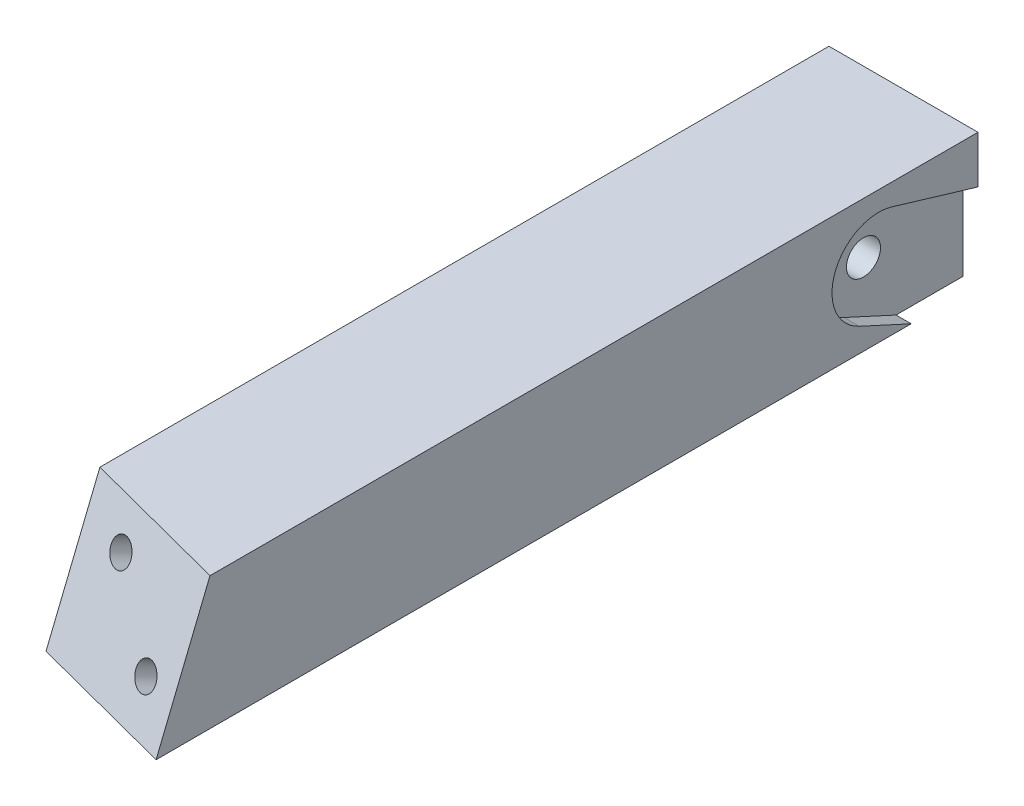
ISO-10303-21;
HEADER;
FILE_DESCRIPTION(('STEP AP214'),'2;1');
FILE_NAME('part.step','',(''),(''),'','','');
FILE_SCHEMA(('AUTOMOTIVE_DESIGN { 1 0 10303 214 1 1 1 1 }'));
ENDSEC;
DATA;
#1=APPLICATION_CONTEXT('core data for automotive mechanical design processes');
#2=APPLICATION_PROTOCOL_DEFINITION('international standard','automotive_design',2000,#1);
#3=PRODUCT_CONTEXT('',#1,'mechanical');
#4=PRODUCT('Part','Part','',(#3));
#5=PRODUCT_RELATED_PRODUCT_CATEGORY('part','',(#4));
#6=PRODUCT_DEFINITION_FORMATION('','',#4);
#7=PRODUCT_DEFINITION_CONTEXT('part definition',#1,'design');
#8=PRODUCT_DEFINITION('design','',#6,#7);
#9=PRODUCT_DEFINITION_SHAPE('','',#8);
#10=(LENGTH_UNIT() NAMED_UNIT(*) SI_UNIT(.MILLI.,.METRE.));
#11=(NAMED_UNIT(*) PLANE_ANGLE_UNIT() SI_UNIT($,.RADIAN.));
#12=(NAMED_UNIT(*) SI_UNIT($,.STERADIAN.) SOLID_ANGLE_UNIT());
#13=UNCERTAINTY_MEASURE_WITH_UNIT(LENGTH_MEASURE(1.E-05),#10,'distance_accuracy_value','');
#14=(GEOMETRIC_REPRESENTATION_CONTEXT(3) GLOBAL_UNCERTAINTY_ASSIGNED_CONTEXT((#13)) GLOBAL_UNIT_ASSIGNED_CONTEXT((#10,
#11,#12)) REPRESENTATION_CONTEXT('',''));
#15=CARTESIAN_POINT('',(0.,0.,0.));
#16=DIRECTION('',(0.,0.,1.));
#17=DIRECTION('',(1.,0.,0.));
#18=AXIS2_PLACEMENT_3D('',#15,#16,#17);
#19=CARTESIAN_POINT('',(14.2875,-12.7,-19.05));
#20=DIRECTION('',(-1.,0.,0.));
#21=DIRECTION('',(0.,0.,-1.));
#22=AXIS2_PLACEMENT_3D('',#19,#20,#21);
#23=PLANE('',#22);
#24=DIRECTION('',(0.,1.,0.));
#25=VECTOR('',#24,1.);
#26=CARTESIAN_POINT('',(14.2875,-12.7,-19.05));
#27=LINE('',#26,#25);
#28=CARTESIAN_POINT('',(14.2875,3.61894096300667,-19.05));
#29=VERTEX_POINT('',#28);
#30=CARTESIAN_POINT('',(14.2875,12.7,-19.05));
#31=VERTEX_POINT('',#30);
#32=EDGE_CURVE('E249',#29,#31,#27,.T.);
#33=ORIENTED_EDGE('',*,*,#32,.T.);
#34=DIRECTION('',(0.,0.,1.));
#35=VECTOR('',#34,1.);
#36=CARTESIAN_POINT('',(14.2875,12.7,-19.05));
#37=LINE('',#36,#35);
#38=CARTESIAN_POINT('',(14.2875,12.7,128.209561077673));
#39=VERTEX_POINT('',#38);
#40=EDGE_CURVE('E174',#31,#39,#37,.T.);
#41=ORIENTED_EDGE('',*,*,#40,.T.);
#42=DIRECTION('',(0.,0.926236048785543,-0.376944003706314));
#43=VECTOR('',#42,1.);
#44=CARTESIAN_POINT('',(14.2875,-23.679683207084,143.014754051566));
#45=LINE('',#44,#43);
#46=CARTESIAN_POINT('',(14.2875,-12.7,138.546426833108));
#47=VERTEX_POINT('',#46);
#48=EDGE_CURVE('E246',#47,#39,#45,.T.);
#49=ORIENTED_EDGE('',*,*,#48,.F.);
#50=DIRECTION('',(0.,0.,1.));
#51=VECTOR('',#50,1.);
#52=CARTESIAN_POINT('',(14.2875,-12.7,-19.05));
#53=LINE('',#52,#51);
#54=CARTESIAN_POINT('',(14.2875,-12.7,-6.24386157288385));
#55=VERTEX_POINT('',#54);
#56=EDGE_CURVE('E158',#55,#47,#53,.T.);
#57=ORIENTED_EDGE('',*,*,#56,.F.);
#58=DIRECTION('',(0.,0.416885836368103,0.908958854643964));
#59=VECTOR('',#58,1.);
#60=CARTESIAN_POINT('',(14.2875,-17.5526565728913,-16.8243725321985));
#61=LINE('',#60,#59);
#62=CARTESIAN_POINT('',(14.2875,-8.12681932760075,3.72729288579994));
#63=VERTEX_POINT('',#62);
#64=EDGE_CURVE('E239',#55,#63,#61,.T.);
#65=ORIENTED_EDGE('',*,*,#64,.T.);
#66=CARTESIAN_POINT('',(14.2875,0.,0.));
#67=DIRECTION('',(1.,0.,0.));
#68=DIRECTION('',(0.,0.,-1.));
#69=AXIS2_PLACEMENT_3D('',#66,#67,#68);
#70=CIRCLE('',#69,8.9408);
#71=CARTESIAN_POINT('',(14.2875,8.56365769597212,-2.56937181159471));
#72=VERTEX_POINT('',#71);
#73=EDGE_CURVE('E183',#63,#72,#70,.F.);
#74=ORIENTED_EDGE('',*,*,#73,.T.);
#75=DIRECTION('',(0.,0.287376052656888,0.957817834642551));
#76=VECTOR('',#75,1.);
#77=CARTESIAN_POINT('',(14.2875,2.27124129471666,-23.5418522823863));
#78=LINE('',#77,#76);
#79=EDGE_CURVE('E236',#29,#72,#78,.T.);
#80=ORIENTED_EDGE('',*,*,#79,.F.);
#81=EDGE_LOOP('',(#33,#41,#49,#57,#65,#74,#80));
#82=FACE_BOUND('',#81,.T.);
#83=ADVANCED_FACE('F41',(#82),#23,.F.);
#84=CARTESIAN_POINT('',(-14.2875,-12.7,-19.05));
#85=DIRECTION('',(0.,1.,0.));
#86=DIRECTION('',(0.,0.,-1.));
#87=AXIS2_PLACEMENT_3D('',#84,#85,#86);
#88=PLANE('',#87);
#89=DIRECTION('',(-0.967499485345023,0.,-0.252872983644192));
#90=VECTOR('',#89,1.);
#91=CARTESIAN_POINT('',(-45.8397648380304,-12.7,101.669894835493));
#92=LINE('',#91,#90);
#93=CARTESIAN_POINT('',(13.9790305203467,-12.7,117.304587659004));
#94=VERTEX_POINT('',#93);
#95=CARTESIAN_POINT('',(9.43867397200995,-12.7,116.117885728329));
#96=VERTEX_POINT('',#95);
#97=EDGE_CURVE('E11',#94,#96,#92,.T.);
#98=ORIENTED_EDGE('',*,*,#97,.T.);
#99=CARTESIAN_POINT('',(12.3568847591208,-12.7,114.231845207382));
#100=DIRECTION('',(0.,-1.,0.));
#101=DIRECTION('',(-0.252872983644192,0.,0.967499485345023));
#102=AXIS2_PLACEMENT_3D('',#99,#100,#101);
#103=ELLIPSE('',#102,6.89838236411544,2.52730000000001);
#104=EDGE_CURVE('E135',#94,#96,#103,.T.);
#105=ORIENTED_EDGE('',*,*,#104,.F.);
#106=EDGE_LOOP('',(#98,#105));
#107=FACE_BOUND('',#106,.T.);
#108=DIRECTION('',(1.,0.,0.));
#109=VECTOR('',#108,1.);
#110=CARTESIAN_POINT('',(-14.2875,-12.7,-19.05));
#111=LINE('',#110,#109);
#112=CARTESIAN_POINT('',(-11.3792,-12.7,-19.05));
#113=VERTEX_POINT('',#112);
#114=CARTESIAN_POINT('',(11.3792,-12.7,-19.05));
#115=VERTEX_POINT('',#114);
#116=EDGE_CURVE('E151',#113,#115,#111,.T.);
#117=ORIENTED_EDGE('',*,*,#116,.T.);
#118=DIRECTION('',(0.,0.,1.));
#119=VECTOR('',#118,1.);
#120=CARTESIAN_POINT('',(11.3792,-12.7,-19.05));
#121=LINE('',#120,#119);
#122=CARTESIAN_POINT('',(11.3792,-12.7,-6.24386157288384));
#123=VERTEX_POINT('',#122);
#124=EDGE_CURVE('E153',#115,#123,#121,.T.);
#125=ORIENTED_EDGE('',*,*,#124,.T.);
#126=DIRECTION('',(1.,0.,0.));
#127=VECTOR('',#126,1.);
#128=CARTESIAN_POINT('',(-14.2875,-12.7,-6.24386157288385));
#129=LINE('',#128,#127);
#130=EDGE_CURVE('E181',#123,#55,#129,.T.);
#131=ORIENTED_EDGE('',*,*,#130,.T.);
#132=ORIENTED_EDGE('',*,*,#56,.T.);
#133=DIRECTION('',(0.967499485345023,0.,0.252872983644192));
#134=VECTOR('',#133,1.);
#135=CARTESIAN_POINT('',(-4.76641557273337,-12.7,133.566351335431));
#136=LINE('',#135,#134);
#137=CARTESIAN_POINT('',(-14.2875,-12.7,131.077848692153));
#138=VERTEX_POINT('',#137);
#139=EDGE_CURVE('E250',#138,#47,#136,.T.);
#140=ORIENTED_EDGE('',*,*,#139,.F.);
#141=DIRECTION('',(0.,0.,1.));
#142=VECTOR('',#141,1.);
#143=CARTESIAN_POINT('',(-14.2875,-12.7,-19.05));
#144=LINE('',#143,#142);
#145=CARTESIAN_POINT('',(-14.2875,-12.7,-6.24386157288385));
#146=VERTEX_POINT('',#145);
#147=EDGE_CURVE('E162',#146,#138,#144,.T.);
#148=ORIENTED_EDGE('',*,*,#147,.F.);
#149=DIRECTION('',(-1.,0.,0.));
#150=VECTOR('',#149,1.);
#151=CARTESIAN_POINT('',(-14.2875,-12.7,-6.24386157288385));
#152=LINE('',#151,#150);
#153=CARTESIAN_POINT('',(-11.3792,-12.7,-6.24386157288385));
#154=VERTEX_POINT('',#153);
#155=EDGE_CURVE('E219',#154,#146,#152,.T.);
#156=ORIENTED_EDGE('',*,*,#155,.F.);
#157=DIRECTION('',(0.,0.,1.));
#158=VECTOR('',#157,1.);
#159=CARTESIAN_POINT('',(-11.3792,-12.7,-19.05));
#160=LINE('',#159,#158);
#161=EDGE_CURVE('E156',#113,#154,#160,.T.);
#162=ORIENTED_EDGE('',*,*,#161,.F.);
#163=EDGE_LOOP('',(#117,#125,#131,#132,#140,#148,#156,#162));
#164=FACE_BOUND('',#163,.T.);
#165=ADVANCED_FACE('F142',(#107,#164),#88,.F.);
#166=CARTESIAN_POINT('',(-14.2875,12.7,-19.05));
#167=DIRECTION('',(0.,-1.,0.));
#168=DIRECTION('',(0.,0.,1.));
#169=AXIS2_PLACEMENT_3D('',#166,#167,#168);
#170=PLANE('',#169);
#171=ORIENTED_EDGE('',*,*,#40,.F.);
#172=DIRECTION('',(-1.,0.,0.));
#173=VECTOR('',#172,1.);
#174=CARTESIAN_POINT('',(-14.2875,12.7,-19.05));
#175=LINE('',#174,#173);
#176=CARTESIAN_POINT('',(-14.2875,12.7,-19.05));
#177=VERTEX_POINT('',#176);
#178=EDGE_CURVE('E165',#31,#177,#175,.T.);
#179=ORIENTED_EDGE('',*,*,#178,.T.);
#180=DIRECTION('',(0.,0.,1.));
#181=VECTOR('',#180,1.);
#182=CARTESIAN_POINT('',(-14.2875,12.7,-19.05));
#183=LINE('',#182,#181);
#184=CARTESIAN_POINT('',(-14.2875,12.7,120.740982936719));
#185=VERTEX_POINT('',#184);
#186=EDGE_CURVE('E171',#177,#185,#183,.T.);
#187=ORIENTED_EDGE('',*,*,#186,.T.);
#188=DIRECTION('',(-0.967499485345023,0.,-0.252872983644192));
#189=VECTOR('',#188,1.);
#190=CARTESIAN_POINT('',(-2.23745504065699,12.7,123.890473833687));
#191=LINE('',#190,#189);
#192=EDGE_CURVE('E242',#39,#185,#191,.T.);
#193=ORIENTED_EDGE('',*,*,#192,.F.);
#194=EDGE_LOOP('',(#171,#179,#187,#193));
#195=FACE_BOUND('',#194,.T.);
#196=ADVANCED_FACE('F145',(#195),#170,.F.);
#197=CARTESIAN_POINT('',(-14.2875,-12.7,-19.05));
#198=DIRECTION('',(1.,0.,0.));
#199=DIRECTION('',(0.,0.,1.));
#200=AXIS2_PLACEMENT_3D('',#197,#198,#199);
#201=PLANE('',#200);
#202=ORIENTED_EDGE('',*,*,#147,.T.);
#203=DIRECTION('',(0.,-0.926236048785543,0.376944003706314));
#204=VECTOR('',#203,1.);
#205=CARTESIAN_POINT('',(-14.2875,-26.287256041271,136.607362144253));
#206=LINE('',#205,#204);
#207=EDGE_CURVE('E245',#185,#138,#206,.T.);
#208=ORIENTED_EDGE('',*,*,#207,.F.);
#209=ORIENTED_EDGE('',*,*,#186,.F.);
#210=DIRECTION('',(0.,-1.,0.));
#211=VECTOR('',#210,1.);
#212=CARTESIAN_POINT('',(-14.2875,-12.7,-19.05));
#213=LINE('',#212,#211);
#214=CARTESIAN_POINT('',(-14.2875,3.61894096300667,-19.05));
#215=VERTEX_POINT('',#214);
#216=EDGE_CURVE('E159',#177,#215,#213,.T.);
#217=ORIENTED_EDGE('',*,*,#216,.T.);
#218=DIRECTION('',(0.,0.287376052656888,0.957817834642551));
#219=VECTOR('',#218,1.);
#220=CARTESIAN_POINT('',(-14.2875,2.27124129471667,-23.5418522823863));
#221=LINE('',#220,#219);
#222=CARTESIAN_POINT('',(-14.2875,8.56365769597212,-2.56937181159471));
#223=VERTEX_POINT('',#222);
#224=EDGE_CURVE('E214',#215,#223,#221,.T.);
#225=ORIENTED_EDGE('',*,*,#224,.T.);
#226=CARTESIAN_POINT('',(-14.2875,0.,0.));
#227=DIRECTION('',(-1.,0.,0.));
#228=DIRECTION('',(0.,0.,1.));
#229=AXIS2_PLACEMENT_3D('',#226,#227,#228);
#230=CIRCLE('',#229,8.9408);
#231=CARTESIAN_POINT('',(-14.2875,-8.12681932760075,3.72729288579994));
#232=VERTEX_POINT('',#231);
#233=EDGE_CURVE('E190',#232,#223,#230,.T.);
#234=ORIENTED_EDGE('',*,*,#233,.F.);
#235=DIRECTION('',(0.,0.416885836368103,0.908958854643964));
#236=VECTOR('',#235,1.);
#237=CARTESIAN_POINT('',(-14.2875,-17.5526565728913,-16.8243725321985));
#238=LINE('',#237,#236);
#239=EDGE_CURVE('E48',#146,#232,#238,.T.);
#240=ORIENTED_EDGE('',*,*,#239,.F.);
#241=EDGE_LOOP('',(#202,#208,#209,#217,#225,#234,#240));
#242=FACE_BOUND('',#241,.T.);
#243=ADVANCED_FACE('F264',(#242),#201,.F.);
#244=CARTESIAN_POINT('',(0.,0.,-19.05));
#245=DIRECTION('',(0.,0.,1.));
#246=DIRECTION('',(-1.,0.,0.));
#247=AXIS2_PLACEMENT_3D('',#244,#245,#246);
#248=PLANE('',#247);
#249=DIRECTION('',(-1.,0.,0.));
#250=VECTOR('',#249,1.);
#251=CARTESIAN_POINT('',(0.,3.61894096300667,-19.05));
#252=LINE('',#251,#250);
#253=CARTESIAN_POINT('',(-11.3792,3.61894096300667,-19.05));
#254=VERTEX_POINT('',#253);
#255=EDGE_CURVE('E186',#254,#215,#252,.T.);
#256=ORIENTED_EDGE('',*,*,#255,.T.);
#257=ORIENTED_EDGE('',*,*,#216,.F.);
#258=ORIENTED_EDGE('',*,*,#178,.F.);
#259=ORIENTED_EDGE('',*,*,#32,.F.);
#260=DIRECTION('',(1.,0.,0.));
#261=VECTOR('',#260,1.);
#262=CARTESIAN_POINT('',(0.,3.61894096300667,-19.05));
#263=LINE('',#262,#261);
#264=CARTESIAN_POINT('',(11.3792,3.61894096300667,-19.05));
#265=VERTEX_POINT('',#264);
#266=EDGE_CURVE('E179',#265,#29,#263,.T.);
#267=ORIENTED_EDGE('',*,*,#266,.F.);
#268=DIRECTION('',(0.,-1.,0.));
#269=VECTOR('',#268,1.);
#270=CARTESIAN_POINT('',(11.3792,0.,-19.05));
#271=LINE('',#270,#269);
#272=EDGE_CURVE('E177',#265,#115,#271,.T.);
#273=ORIENTED_EDGE('',*,*,#272,.T.);
#274=ORIENTED_EDGE('',*,*,#116,.F.);
#275=DIRECTION('',(0.,-1.,0.));
#276=VECTOR('',#275,1.);
#277=CARTESIAN_POINT('',(-11.3792,0.,-19.05));
#278=LINE('',#277,#276);
#279=EDGE_CURVE('E188',#254,#113,#278,.T.);
#280=ORIENTED_EDGE('',*,*,#279,.F.);
#281=EDGE_LOOP('',(#256,#257,#258,#259,#267,#273,#274,#280));
#282=FACE_BOUND('',#281,.T.);
#283=ADVANCED_FACE('F259',(#282),#248,.F.);
#284=CARTESIAN_POINT('',(-280.001206524604,513.061677155235,-152.336759913998));
#285=DIRECTION('',(-0.235291406157388,0.366361252044642,0.900231851907475));
#286=DIRECTION('',(0.,0.926236048785543,-0.376944003706314));
#287=AXIS2_PLACEMENT_3D('',#284,#285,#286);
#288=PLANE('',#287);
#289=CARTESIAN_POINT('',(7.31353025020149,-4.84722839831759,133.527868141401));
#290=DIRECTION('',(0.235291406157388,-0.366361252044642,-0.900231851907475));
#291=DIRECTION('',(0.,0.926236048785543,-0.376944003706314));
#292=AXIS2_PLACEMENT_3D('',#289,#290,#291);
#293=CIRCLE('',#292,2.52730000000001);
#294=CARTESIAN_POINT('',(7.31353025020149,-2.50635203222188,132.575217560834));
#295=VERTEX_POINT('',#294);
#296=EDGE_CURVE('E136',#295,#295,#293,.T.);
#297=ORIENTED_EDGE('',*,*,#296,.T.);
#298=EDGE_LOOP('',(#297));
#299=FACE_BOUND('',#298,.T.);
#300=CARTESIAN_POINT('',(-5.02991560705652,5.7895850258907,125.972899938455));
#301=DIRECTION('',(0.235291406157388,-0.366361252044642,-0.900231851907475));
#302=DIRECTION('',(0.,0.926236048785543,-0.376944003706314));
#303=AXIS2_PLACEMENT_3D('',#300,#301,#302);
#304=CIRCLE('',#303,2.52730000000001);
#305=CARTESIAN_POINT('',(-5.02991560705652,8.13046139198641,125.020249357888));
#306=VERTEX_POINT('',#305);
#307=EDGE_CURVE('E455',#306,#306,#304,.T.);
#308=ORIENTED_EDGE('',*,*,#307,.T.);
#309=EDGE_LOOP('',(#308));
#310=FACE_BOUND('',#309,.T.);
#311=ORIENTED_EDGE('',*,*,#48,.T.);
#312=ORIENTED_EDGE('',*,*,#192,.T.);
#313=ORIENTED_EDGE('',*,*,#207,.T.);
#314=ORIENTED_EDGE('',*,*,#139,.T.);
#315=EDGE_LOOP('',(#311,#312,#313,#314));
#316=FACE_BOUND('',#315,.T.);
#317=ADVANCED_FACE('F268',(#299,#310,#316),#288,.T.);
#318=CARTESIAN_POINT('',(14.605,0.,0.));
#319=DIRECTION('',(-1.,0.,0.));
#320=DIRECTION('',(0.,-0.352977339307905,-0.935631870948779));
#321=AXIS2_PLACEMENT_3D('',#318,#319,#320);
#322=CYLINDRICAL_SURFACE('',#321,8.9408);
#323=ORIENTED_EDGE('',*,*,#73,.F.);
#324=DIRECTION('',(-1.,0.,0.));
#325=VECTOR('',#324,1.);
#326=CARTESIAN_POINT('',(14.605,-8.12681932760075,3.72729288579994));
#327=LINE('',#326,#325);
#328=CARTESIAN_POINT('',(11.3792,-8.12681932760075,3.72729288579994));
#329=VERTEX_POINT('',#328);
#330=EDGE_CURVE('E226',#63,#329,#327,.T.);
#331=ORIENTED_EDGE('',*,*,#330,.T.);
#332=CARTESIAN_POINT('',(11.3792,0.,0.));
#333=DIRECTION('',(-1.,0.,0.));
#334=DIRECTION('',(0.,1.,0.));
#335=AXIS2_PLACEMENT_3D('',#332,#333,#334);
#336=CIRCLE('',#335,8.9408);
#337=CARTESIAN_POINT('',(11.3792,8.56365769597212,-2.56937181159471));
#338=VERTEX_POINT('',#337);
#339=EDGE_CURVE('E222',#338,#329,#336,.F.);
#340=ORIENTED_EDGE('',*,*,#339,.F.);
#341=DIRECTION('',(-1.,0.,0.));
#342=VECTOR('',#341,1.);
#343=CARTESIAN_POINT('',(14.605,8.56365769597212,-2.56937181159471));
#344=LINE('',#343,#342);
#345=EDGE_CURVE('E223',#72,#338,#344,.T.);
#346=ORIENTED_EDGE('',*,*,#345,.F.);
#347=EDGE_LOOP('',(#323,#331,#340,#346));
#348=FACE_BOUND('',#347,.T.);
#349=ADVANCED_FACE('F339',(#348),#322,.F.);
#350=CARTESIAN_POINT('',(14.605,-8.12681932760075,3.72729288579994));
#351=DIRECTION('',(0.,0.908958854643964,-0.416885836368103));
#352=DIRECTION('',(0.,0.416885836368103,0.908958854643964));
#353=AXIS2_PLACEMENT_3D('',#350,#351,#352);
#354=PLANE('',#353);
#355=ORIENTED_EDGE('',*,*,#64,.F.);
#356=ORIENTED_EDGE('',*,*,#130,.F.);
#357=DIRECTION('',(0.,-0.416885836368103,-0.908958854643964));
#358=VECTOR('',#357,1.);
#359=CARTESIAN_POINT('',(11.3792,-8.12681932760075,3.72729288579994));
#360=LINE('',#359,#358);
#361=EDGE_CURVE('E229',#329,#123,#360,.T.);
#362=ORIENTED_EDGE('',*,*,#361,.F.);
#363=ORIENTED_EDGE('',*,*,#330,.F.);
#364=EDGE_LOOP('',(#355,#356,#362,#363));
#365=FACE_BOUND('',#364,.T.);
#366=ADVANCED_FACE('F283',(#365),#354,.T.);
#367=CARTESIAN_POINT('',(14.605,8.56365769597212,-2.56937181159471));
#368=DIRECTION('',(0.,0.957817834642551,-0.287376052656888));
#369=DIRECTION('',(0.,0.287376052656888,0.957817834642551));
#370=AXIS2_PLACEMENT_3D('',#367,#368,#369);
#371=PLANE('',#370);
#372=ORIENTED_EDGE('',*,*,#266,.T.);
#373=ORIENTED_EDGE('',*,*,#79,.T.);
#374=ORIENTED_EDGE('',*,*,#345,.T.);
#375=DIRECTION('',(0.,-0.287376052656888,-0.957817834642551));
#376=VECTOR('',#375,1.);
#377=CARTESIAN_POINT('',(11.3792,8.56365769597212,-2.56937181159471));
#378=LINE('',#377,#376);
#379=EDGE_CURVE('E227',#338,#265,#378,.T.);
#380=ORIENTED_EDGE('',*,*,#379,.T.);
#381=EDGE_LOOP('',(#372,#373,#374,#380));
#382=FACE_BOUND('',#381,.T.);
#383=ADVANCED_FACE('F275',(#382),#371,.F.);
#384=CARTESIAN_POINT('',(11.3792,0.,0.));
#385=DIRECTION('',(1.,0.,0.));
#386=DIRECTION('',(0.,0.352977339307905,0.935631870948779));
#387=AXIS2_PLACEMENT_3D('',#384,#385,#386);
#388=PLANE('',#387);
#389=CARTESIAN_POINT('',(11.3792,0.,0.));
#390=DIRECTION('',(-1.,0.,0.));
#391=DIRECTION('',(0.,1.,0.));
#392=AXIS2_PLACEMENT_3D('',#389,#390,#391);
#393=CIRCLE('',#392,3.2639);
#394=CARTESIAN_POINT('',(11.3792,3.2639,0.));
#395=VERTEX_POINT('',#394);
#396=EDGE_CURVE('E195',#395,#395,#393,.T.);
#397=ORIENTED_EDGE('',*,*,#396,.T.);
#398=EDGE_LOOP('',(#397));
#399=FACE_BOUND('',#398,.T.);
#400=ORIENTED_EDGE('',*,*,#124,.F.);
#401=ORIENTED_EDGE('',*,*,#272,.F.);
#402=ORIENTED_EDGE('',*,*,#379,.F.);
#403=ORIENTED_EDGE('',*,*,#339,.T.);
#404=ORIENTED_EDGE('',*,*,#361,.T.);
#405=EDGE_LOOP('',(#400,#401,#402,#403,#404));
#406=FACE_BOUND('',#405,.T.);
#407=ADVANCED_FACE('F279',(#399,#406),#388,.T.);
#408=CARTESIAN_POINT('',(-14.732,-8.12681932760075,3.72729288579994));
#409=DIRECTION('',(0.,-0.908958854643964,0.416885836368103));
#410=DIRECTION('',(0.,-0.416885836368104,-0.908958854643964));
#411=AXIS2_PLACEMENT_3D('',#408,#409,#410);
#412=PLANE('',#411);
#413=DIRECTION('',(0.,-0.416885836368103,-0.908958854643964));
#414=VECTOR('',#413,1.);
#415=CARTESIAN_POINT('',(-11.3792,-8.12681932760075,3.72729288579994));
#416=LINE('',#415,#414);
#417=CARTESIAN_POINT('',(-11.3792,-8.12681932760075,3.72729288579994));
#418=VERTEX_POINT('',#417);
#419=EDGE_CURVE('E207',#418,#154,#416,.T.);
#420=ORIENTED_EDGE('',*,*,#419,.T.);
#421=ORIENTED_EDGE('',*,*,#155,.T.);
#422=ORIENTED_EDGE('',*,*,#239,.T.);
#423=DIRECTION('',(-1.,0.,0.));
#424=VECTOR('',#423,1.);
#425=CARTESIAN_POINT('',(-14.732,-8.12681932760075,3.72729288579994));
#426=LINE('',#425,#424);
#427=EDGE_CURVE('E209',#232,#418,#426,.F.);
#428=ORIENTED_EDGE('',*,*,#427,.T.);
#429=EDGE_LOOP('',(#420,#421,#422,#428));
#430=FACE_BOUND('',#429,.T.);
#431=ADVANCED_FACE('F285',(#430),#412,.F.);
#432=CARTESIAN_POINT('',(-14.732,0.,0.));
#433=DIRECTION('',(1.,0.,0.));
#434=DIRECTION('',(0.,0.352977339307905,0.935631870948779));
#435=AXIS2_PLACEMENT_3D('',#432,#433,#434);
#436=CYLINDRICAL_SURFACE('',#435,8.9408);
#437=ORIENTED_EDGE('',*,*,#427,.F.);
#438=ORIENTED_EDGE('',*,*,#233,.T.);
#439=DIRECTION('',(1.,0.,0.));
#440=VECTOR('',#439,1.);
#441=CARTESIAN_POINT('',(-14.732,8.56365769597212,-2.56937181159471));
#442=LINE('',#441,#440);
#443=CARTESIAN_POINT('',(-11.3792,8.56365769597212,-2.56937181159471));
#444=VERTEX_POINT('',#443);
#445=EDGE_CURVE('E199',#223,#444,#442,.T.);
#446=ORIENTED_EDGE('',*,*,#445,.T.);
#447=CARTESIAN_POINT('',(-11.3792,0.,0.));
#448=DIRECTION('',(-1.,0.,0.));
#449=DIRECTION('',(0.,1.,0.));
#450=AXIS2_PLACEMENT_3D('',#447,#448,#449);
#451=CIRCLE('',#450,8.9408);
#452=EDGE_CURVE('E210',#444,#418,#451,.F.);
#453=ORIENTED_EDGE('',*,*,#452,.T.);
#454=EDGE_LOOP('',(#437,#438,#446,#453));
#455=FACE_BOUND('',#454,.T.);
#456=ADVANCED_FACE('F292',(#455),#436,.F.);
#457=CARTESIAN_POINT('',(-11.3792,0.,0.));
#458=DIRECTION('',(1.,0.,0.));
#459=DIRECTION('',(0.,0.352977339307905,0.935631870948779));
#460=AXIS2_PLACEMENT_3D('',#457,#458,#459);
#461=PLANE('',#460);
#462=CARTESIAN_POINT('',(-11.3792,0.,0.));
#463=DIRECTION('',(-1.,0.,0.));
#464=DIRECTION('',(0.,1.,0.));
#465=AXIS2_PLACEMENT_3D('',#462,#463,#464);
#466=CIRCLE('',#465,3.2639);
#467=CARTESIAN_POINT('',(-11.3792,3.2639,0.));
#468=VERTEX_POINT('',#467);
#469=EDGE_CURVE('E140',#468,#468,#466,.T.);
#470=ORIENTED_EDGE('',*,*,#469,.F.);
#471=EDGE_LOOP('',(#470));
#472=FACE_BOUND('',#471,.T.);
#473=ORIENTED_EDGE('',*,*,#279,.T.);
#474=ORIENTED_EDGE('',*,*,#161,.T.);
#475=ORIENTED_EDGE('',*,*,#419,.F.);
#476=ORIENTED_EDGE('',*,*,#452,.F.);
#477=DIRECTION('',(0.,-0.287376052656888,-0.957817834642551));
#478=VECTOR('',#477,1.);
#479=CARTESIAN_POINT('',(-11.3792,8.56365769597212,-2.56937181159471));
#480=LINE('',#479,#478);
#481=EDGE_CURVE('E62',#444,#254,#480,.T.);
#482=ORIENTED_EDGE('',*,*,#481,.T.);
#483=EDGE_LOOP('',(#473,#474,#475,#476,#482));
#484=FACE_BOUND('',#483,.T.);
#485=ADVANCED_FACE('F288',(#472,#484),#461,.F.);
#486=CARTESIAN_POINT('',(-14.732,8.56365769597212,-2.56937181159471));
#487=DIRECTION('',(0.,-0.957817834642551,0.287376052656888));
#488=DIRECTION('',(0.,-0.287376052656888,-0.957817834642551));
#489=AXIS2_PLACEMENT_3D('',#486,#487,#488);
#490=PLANE('',#489);
#491=ORIENTED_EDGE('',*,*,#224,.F.);
#492=ORIENTED_EDGE('',*,*,#255,.F.);
#493=ORIENTED_EDGE('',*,*,#481,.F.);
#494=ORIENTED_EDGE('',*,*,#445,.F.);
#495=EDGE_LOOP('',(#491,#492,#493,#494));
#496=FACE_BOUND('',#495,.T.);
#497=ADVANCED_FACE('F290',(#496),#490,.T.);
#498=CARTESIAN_POINT('',(-14.2875,0.,0.));
#499=DIRECTION('',(1.,0.,0.));
#500=DIRECTION('',(0.,0.,1.));
#501=AXIS2_PLACEMENT_3D('',#498,#499,#500);
#502=CYLINDRICAL_SURFACE('',#501,3.2639);
#503=ORIENTED_EDGE('',*,*,#396,.F.);
#504=EDGE_LOOP('',(#503));
#505=FACE_BOUND('',#504,.T.);
#506=ORIENTED_EDGE('',*,*,#469,.T.);
#507=EDGE_LOOP('',(#506));
#508=FACE_BOUND('',#507,.T.);
#509=ADVANCED_FACE('F403',(#505,#508),#502,.F.);
#510=CARTESIAN_POINT('',(-0.54761431975828,-1.18959682555972,108.823483159617));
#511=DIRECTION('',(-0.235291406157388,0.366361252044641,0.900231851907475));
#512=DIRECTION('',(0.,0.926236048785543,-0.376944003706314));
#513=AXIS2_PLACEMENT_3D('',#510,#511,#512);
#514=CYLINDRICAL_SURFACE('',#513,2.52730000000001);
#515=CARTESIAN_POINT('',(-0.54761431975828,-1.18959682555972,108.823483159617));
#516=DIRECTION('',(0.235291406157388,-0.366361252044642,-0.900231851907475));
#517=DIRECTION('',(0.,0.926236048785543,-0.376944003706314));
#518=AXIS2_PLACEMENT_3D('',#515,#516,#517);
#519=CIRCLE('',#518,2.52730000000001);
#520=CARTESIAN_POINT('',(-0.54761431975828,1.15127954053598,107.87083257905));
#521=VERTEX_POINT('',#520);
#522=EDGE_CURVE('E458',#521,#521,#519,.T.);
#523=ORIENTED_EDGE('',*,*,#522,.T.);
#524=EDGE_LOOP('',(#523));
#525=FACE_BOUND('',#524,.T.);
#526=ORIENTED_EDGE('',*,*,#307,.F.);
#527=EDGE_LOOP('',(#526));
#528=FACE_BOUND('',#527,.T.);
#529=ADVANCED_FACE('F414',(#525,#528),#514,.F.);
#530=CARTESIAN_POINT('',(-0.54761431975828,-1.18959682555972,108.823483159617));
#531=DIRECTION('',(-0.235291406157388,0.366361252044642,0.900231851907475));
#532=DIRECTION('',(0.,0.926236048785543,-0.376944003706314));
#533=AXIS2_PLACEMENT_3D('',#530,#531,#532);
#534=PLANE('',#533);
#535=ORIENTED_EDGE('',*,*,#522,.F.);
#536=EDGE_LOOP('',(#535));
#537=FACE_BOUND('',#536,.T.);
#538=ADVANCED_FACE('F424',(#537),#534,.T.);
#539=CARTESIAN_POINT('',(11.7958315374997,-11.826410249768,116.378451362563));
#540=DIRECTION('',(-0.235291406157388,0.366361252044642,0.900231851907475));
#541=DIRECTION('',(0.,0.926236048785543,-0.376944003706314));
#542=AXIS2_PLACEMENT_3D('',#539,#540,#541);
#543=PLANE('',#542);
#544=ORIENTED_EDGE('',*,*,#97,.F.);
#545=CARTESIAN_POINT('',(11.7958315374997,-11.826410249768,116.378451362563));
#546=DIRECTION('',(0.235291406157388,-0.366361252044642,-0.900231851907475));
#547=DIRECTION('',(0.,0.926236048785543,-0.376944003706314));
#548=AXIS2_PLACEMENT_3D('',#545,#546,#547);
#549=CIRCLE('',#548,2.52730000000001);
#550=EDGE_CURVE('E54',#96,#94,#549,.T.);
#551=ORIENTED_EDGE('',*,*,#550,.F.);
#552=EDGE_LOOP('',(#544,#551));
#553=FACE_BOUND('',#552,.T.);
#554=ADVANCED_FACE('F134',(#553),#543,.T.);
#555=CARTESIAN_POINT('',(11.7958315374997,-11.826410249768,116.378451362563));
#556=DIRECTION('',(-0.235291406157388,0.366361252044641,0.900231851907475));
#557=DIRECTION('',(0.,0.926236048785543,-0.376944003706314));
#558=AXIS2_PLACEMENT_3D('',#555,#556,#557);
#559=CYLINDRICAL_SURFACE('',#558,2.52730000000001);
#560=ORIENTED_EDGE('',*,*,#296,.F.);
#561=EDGE_LOOP('',(#560));
#562=FACE_BOUND('',#561,.T.);
#563=ORIENTED_EDGE('',*,*,#550,.T.);
#564=ORIENTED_EDGE('',*,*,#104,.T.);
#565=EDGE_LOOP('',(#563,#564));
#566=FACE_BOUND('',#565,.T.);
#567=ADVANCED_FACE('F138',(#562,#566),#559,.F.);
#568=CLOSED_SHELL('',(#83,#165,#196,#243,#283,#317,#349,#366,#383,#407,#431,#456,#485,#497,#509,
#529,#538,#554,#567));
#569=MANIFOLD_SOLID_BREP('B2',#568);
#570=ADVANCED_BREP_SHAPE_REPRESENTATION('',(#18,#569),#14);
#571=SHAPE_DEFINITION_REPRESENTATION(#9,#570);
ENDSEC;
END-ISO-10303-21;
